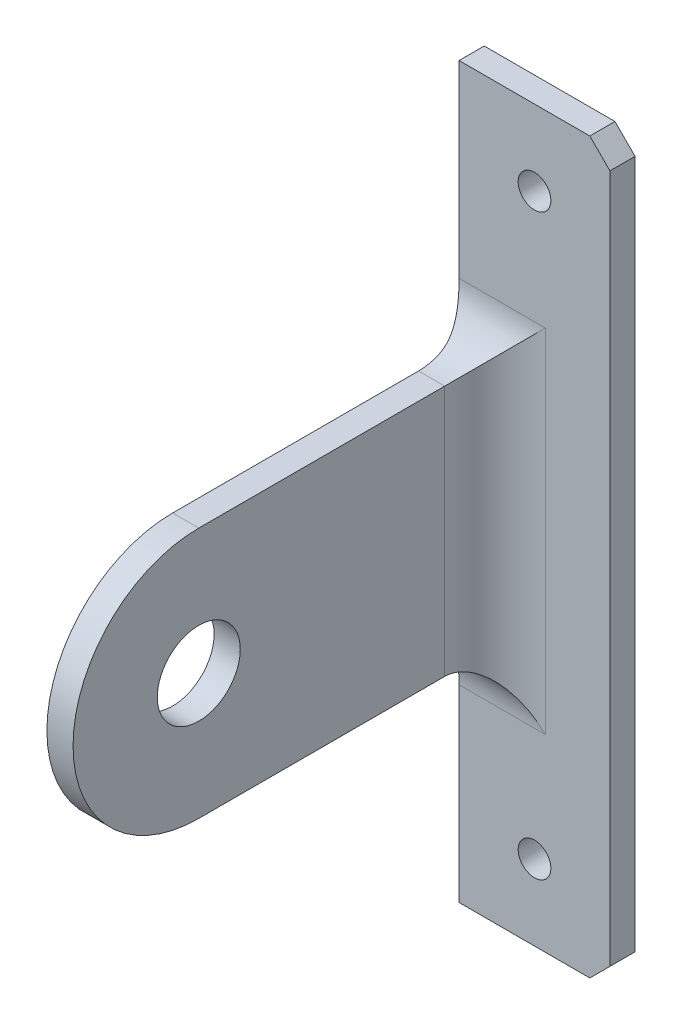
ISO-10303-21;
HEADER;
FILE_DESCRIPTION(('STEP AP214'),'2;1');
FILE_NAME('part.step','',(''),(''),'','','');
FILE_SCHEMA(('AUTOMOTIVE_DESIGN { 1 0 10303 214 1 1 1 1 }'));
ENDSEC;
DATA;
#1=APPLICATION_CONTEXT('core data for automotive mechanical design processes');
#2=APPLICATION_PROTOCOL_DEFINITION('international standard','automotive_design',2000,#1);
#3=PRODUCT_CONTEXT('',#1,'mechanical');
#4=PRODUCT('Part','Part','',(#3));
#5=PRODUCT_RELATED_PRODUCT_CATEGORY('part','',(#4));
#6=PRODUCT_DEFINITION_FORMATION('','',#4);
#7=PRODUCT_DEFINITION_CONTEXT('part definition',#1,'design');
#8=PRODUCT_DEFINITION('design','',#6,#7);
#9=PRODUCT_DEFINITION_SHAPE('','',#8);
#10=(LENGTH_UNIT() NAMED_UNIT(*) SI_UNIT(.MILLI.,.METRE.));
#11=(NAMED_UNIT(*) PLANE_ANGLE_UNIT() SI_UNIT($,.RADIAN.));
#12=(NAMED_UNIT(*) SI_UNIT($,.STERADIAN.) SOLID_ANGLE_UNIT());
#13=UNCERTAINTY_MEASURE_WITH_UNIT(LENGTH_MEASURE(1.E-05),#10,'distance_accuracy_value','');
#14=(GEOMETRIC_REPRESENTATION_CONTEXT(3) GLOBAL_UNCERTAINTY_ASSIGNED_CONTEXT((#13)) GLOBAL_UNIT_ASSIGNED_CONTEXT((#10,
#11,#12)) REPRESENTATION_CONTEXT('',''));
#15=CARTESIAN_POINT('',(0.,0.,0.));
#16=DIRECTION('',(0.,0.,1.));
#17=DIRECTION('',(1.,0.,0.));
#18=AXIS2_PLACEMENT_3D('',#15,#16,#17);
#19=CARTESIAN_POINT('',(2.6,12.5,-4.125));
#20=DIRECTION('',(-1.,0.,0.));
#21=DIRECTION('',(0.,0.,1.));
#22=AXIS2_PLACEMENT_3D('',#19,#20,#21);
#23=PLANE('',#22);
#24=CARTESIAN_POINT('',(2.6,0.,0.));
#25=DIRECTION('',(1.,0.,0.));
#26=DIRECTION('',(0.,0.,-1.));
#27=AXIS2_PLACEMENT_3D('',#24,#25,#26);
#28=CIRCLE('',#27,4.125);
#29=CARTESIAN_POINT('',(2.6,0.,-4.125));
#30=VERTEX_POINT('',#29);
#31=EDGE_CURVE('E188',#30,#30,#28,.T.);
#32=ORIENTED_EDGE('',*,*,#31,.F.);
#33=EDGE_LOOP('',(#32));
#34=FACE_BOUND('',#33,.T.);
#35=DIRECTION('',(0.,0.,-1.));
#36=VECTOR('',#35,1.);
#37=CARTESIAN_POINT('',(2.6,-12.5,-4.125));
#38=LINE('',#37,#36);
#39=CARTESIAN_POINT('',(2.6,-12.5,0.));
#40=VERTEX_POINT('',#39);
#41=CARTESIAN_POINT('',(2.6,-12.5,-24.45));
#42=VERTEX_POINT('',#41);
#43=EDGE_CURVE('E195',#40,#42,#38,.T.);
#44=ORIENTED_EDGE('',*,*,#43,.T.);
#45=DIRECTION('',(0.,-1.,0.));
#46=VECTOR('',#45,1.);
#47=CARTESIAN_POINT('',(2.6,12.5,-24.45));
#48=LINE('',#47,#46);
#49=CARTESIAN_POINT('',(2.6,12.5,-24.45));
#50=VERTEX_POINT('',#49);
#51=EDGE_CURVE('E224',#42,#50,#48,.F.);
#52=ORIENTED_EDGE('',*,*,#51,.T.);
#53=DIRECTION('',(0.,0.,-1.));
#54=VECTOR('',#53,1.);
#55=CARTESIAN_POINT('',(2.6,12.5,-4.125));
#56=LINE('',#55,#54);
#57=CARTESIAN_POINT('',(2.6,12.5,0.));
#58=VERTEX_POINT('',#57);
#59=EDGE_CURVE('E203',#58,#50,#56,.T.);
#60=ORIENTED_EDGE('',*,*,#59,.F.);
#61=CARTESIAN_POINT('',(2.6,0.,0.));
#62=DIRECTION('',(1.,0.,0.));
#63=DIRECTION('',(0.,0.,-1.));
#64=AXIS2_PLACEMENT_3D('',#61,#62,#63);
#65=CIRCLE('',#64,12.5);
#66=EDGE_CURVE('E196',#58,#40,#65,.T.);
#67=ORIENTED_EDGE('',*,*,#66,.T.);
#68=EDGE_LOOP('',(#44,#52,#60,#67));
#69=FACE_BOUND('',#68,.T.);
#70=ADVANCED_FACE('F41',(#34,#69),#23,.F.);
#71=CARTESIAN_POINT('',(0.,12.5,-4.125));
#72=DIRECTION('',(1.,0.,0.));
#73=DIRECTION('',(0.,0.,-1.));
#74=AXIS2_PLACEMENT_3D('',#71,#72,#73);
#75=PLANE('',#74);
#76=CARTESIAN_POINT('',(0.,0.,0.));
#77=DIRECTION('',(1.,0.,0.));
#78=DIRECTION('',(0.,0.,-1.));
#79=AXIS2_PLACEMENT_3D('',#76,#77,#78);
#80=CIRCLE('',#79,4.125);
#81=CARTESIAN_POINT('',(0.,0.,-4.125));
#82=VERTEX_POINT('',#81);
#83=EDGE_CURVE('E192',#82,#82,#80,.T.);
#84=ORIENTED_EDGE('',*,*,#83,.T.);
#85=EDGE_LOOP('',(#84));
#86=FACE_BOUND('',#85,.T.);
#87=DIRECTION('',(0.,0.,1.));
#88=VECTOR('',#87,1.);
#89=CARTESIAN_POINT('',(0.,12.5,-4.125));
#90=LINE('',#89,#88);
#91=CARTESIAN_POINT('',(0.,12.5,-24.45));
#92=VERTEX_POINT('',#91);
#93=CARTESIAN_POINT('',(0.,12.5,0.));
#94=VERTEX_POINT('',#93);
#95=EDGE_CURVE('E206',#92,#94,#90,.T.);
#96=ORIENTED_EDGE('',*,*,#95,.F.);
#97=CARTESIAN_POINT('',(0.,17.5,-24.45));
#98=DIRECTION('',(1.,0.,0.));
#99=DIRECTION('',(0.,0.,-1.));
#100=AXIS2_PLACEMENT_3D('',#97,#98,#99);
#101=CIRCLE('',#100,5.);
#102=CARTESIAN_POINT('',(0.,12.9352791185284,-26.4904223274257));
#103=VERTEX_POINT('',#102);
#104=EDGE_CURVE('E316',#92,#103,#101,.T.);
#105=ORIENTED_EDGE('',*,*,#104,.T.);
#106=CARTESIAN_POINT('',(0.,12.9352791185284,-26.4904223274257));
#107=CARTESIAN_POINT('',(0.,12.5,-26.4904223274257));
#108=B_SPLINE_CURVE_WITH_KNOTS('',1,(#106,#107),.UNSPECIFIED.,.F.,.F.,(2,2),(0.,1.),.UNSPECIFIED.);
#109=CARTESIAN_POINT('',(0.,12.5,-26.4904223274257));
#110=VERTEX_POINT('',#109);
#111=EDGE_CURVE('E228',#103,#110,#108,.T.);
#112=ORIENTED_EDGE('',*,*,#111,.T.);
#113=DIRECTION('',(0.,-1.,0.));
#114=VECTOR('',#113,1.);
#115=CARTESIAN_POINT('',(0.,12.5,-26.4904223274257));
#116=LINE('',#115,#114);
#117=CARTESIAN_POINT('',(0.,-12.5,-26.4904223274257));
#118=VERTEX_POINT('',#117);
#119=EDGE_CURVE('E220',#110,#118,#116,.T.);
#120=ORIENTED_EDGE('',*,*,#119,.T.);
#121=CARTESIAN_POINT('',(0.,-12.5,-26.4904223274257));
#122=CARTESIAN_POINT('',(0.,-12.9352791185284,-26.4904223274257));
#123=B_SPLINE_CURVE_WITH_KNOTS('',1,(#121,#122),.UNSPECIFIED.,.F.,.F.,(2,2),(0.,1.),.UNSPECIFIED.);
#124=CARTESIAN_POINT('',(0.,-12.9352791185284,-26.4904223274257));
#125=VERTEX_POINT('',#124);
#126=EDGE_CURVE('E232',#118,#125,#123,.T.);
#127=ORIENTED_EDGE('',*,*,#126,.T.);
#128=CARTESIAN_POINT('',(0.,-17.5,-24.45));
#129=DIRECTION('',(1.,0.,0.));
#130=DIRECTION('',(0.,0.,-1.));
#131=AXIS2_PLACEMENT_3D('',#128,#129,#130);
#132=CIRCLE('',#131,5.);
#133=CARTESIAN_POINT('',(0.,-12.5,-24.45));
#134=VERTEX_POINT('',#133);
#135=EDGE_CURVE('E226',#125,#134,#132,.T.);
#136=ORIENTED_EDGE('',*,*,#135,.T.);
#137=DIRECTION('',(0.,0.,1.));
#138=VECTOR('',#137,1.);
#139=CARTESIAN_POINT('',(0.,-12.5,-4.125));
#140=LINE('',#139,#138);
#141=CARTESIAN_POINT('',(0.,-12.5,0.));
#142=VERTEX_POINT('',#141);
#143=EDGE_CURVE('E207',#134,#142,#140,.T.);
#144=ORIENTED_EDGE('',*,*,#143,.T.);
#145=CARTESIAN_POINT('',(0.,0.,0.));
#146=DIRECTION('',(1.,0.,0.));
#147=DIRECTION('',(0.,0.,-1.));
#148=AXIS2_PLACEMENT_3D('',#145,#146,#147);
#149=CIRCLE('',#148,12.5);
#150=EDGE_CURVE('E184',#94,#142,#149,.T.);
#151=ORIENTED_EDGE('',*,*,#150,.F.);
#152=EDGE_LOOP('',(#96,#105,#112,#120,#127,#136,#144,#151));
#153=FACE_BOUND('',#152,.T.);
#154=ADVANCED_FACE('F235',(#86,#153),#75,.F.);
#155=CARTESIAN_POINT('',(2.6,12.5,-31.95));
#156=DIRECTION('',(0.,0.,1.));
#157=DIRECTION('',(1.,0.,0.));
#158=AXIS2_PLACEMENT_3D('',#155,#156,#157);
#159=PLANE('',#158);
#160=CARTESIAN_POINT('',(6.53,-28.75,-31.95));
#161=DIRECTION('',(0.,0.,1.));
#162=DIRECTION('',(-1.,0.,0.));
#163=AXIS2_PLACEMENT_3D('',#160,#161,#162);
#164=CIRCLE('',#163,1.625);
#165=CARTESIAN_POINT('',(4.905,-28.75,-31.95));
#166=VERTEX_POINT('',#165);
#167=EDGE_CURVE('E364',#166,#166,#164,.T.);
#168=ORIENTED_EDGE('',*,*,#167,.T.);
#169=EDGE_LOOP('',(#168));
#170=FACE_BOUND('',#169,.T.);
#171=CARTESIAN_POINT('',(6.53,28.75,-31.95));
#172=DIRECTION('',(0.,0.,-1.));
#173=DIRECTION('',(-1.,0.,0.));
#174=AXIS2_PLACEMENT_3D('',#171,#172,#173);
#175=CIRCLE('',#174,1.625);
#176=CARTESIAN_POINT('',(4.905,28.75,-31.95));
#177=VERTEX_POINT('',#176);
#178=EDGE_CURVE('E356',#177,#177,#175,.T.);
#179=ORIENTED_EDGE('',*,*,#178,.F.);
#180=EDGE_LOOP('',(#179));
#181=FACE_BOUND('',#180,.T.);
#182=DIRECTION('',(0.,-1.,0.));
#183=VECTOR('',#182,1.);
#184=CARTESIAN_POINT('',(14.03,12.5,-31.95));
#185=LINE('',#184,#183);
#186=CARTESIAN_POINT('',(14.03,34.25,-31.95));
#187=VERTEX_POINT('',#186);
#188=CARTESIAN_POINT('',(14.03,-34.25,-31.95));
#189=VERTEX_POINT('',#188);
#190=EDGE_CURVE('E181',#187,#189,#185,.T.);
#191=ORIENTED_EDGE('',*,*,#190,.T.);
#192=DIRECTION('',(0.70710678118655,0.707106781186545,0.));
#193=VECTOR('',#192,1.);
#194=CARTESIAN_POINT('',(14.03,-34.25,-31.95));
#195=LINE('',#194,#193);
#196=CARTESIAN_POINT('',(12.03,-36.25,-31.95));
#197=VERTEX_POINT('',#196);
#198=EDGE_CURVE('E311',#189,#197,#195,.F.);
#199=ORIENTED_EDGE('',*,*,#198,.T.);
#200=DIRECTION('',(1.,0.,0.));
#201=VECTOR('',#200,1.);
#202=CARTESIAN_POINT('',(-0.97,-36.25,-31.95));
#203=LINE('',#202,#201);
#204=CARTESIAN_POINT('',(-0.97,-36.25,-31.95));
#205=VERTEX_POINT('',#204);
#206=EDGE_CURVE('E162',#205,#197,#203,.T.);
#207=ORIENTED_EDGE('',*,*,#206,.F.);
#208=DIRECTION('',(0.,-1.,0.));
#209=VECTOR('',#208,1.);
#210=CARTESIAN_POINT('',(-0.97,12.5,-31.95));
#211=LINE('',#210,#209);
#212=CARTESIAN_POINT('',(-0.97,36.25,-31.95));
#213=VERTEX_POINT('',#212);
#214=EDGE_CURVE('E166',#213,#205,#211,.T.);
#215=ORIENTED_EDGE('',*,*,#214,.F.);
#216=DIRECTION('',(1.,0.,0.));
#217=VECTOR('',#216,1.);
#218=CARTESIAN_POINT('',(14.03,36.25,-31.95));
#219=LINE('',#218,#217);
#220=CARTESIAN_POINT('',(12.03,36.25,-31.95));
#221=VERTEX_POINT('',#220);
#222=EDGE_CURVE('E167',#213,#221,#219,.T.);
#223=ORIENTED_EDGE('',*,*,#222,.T.);
#224=DIRECTION('',(0.707106781186545,-0.70710678118655,0.));
#225=VECTOR('',#224,1.);
#226=CARTESIAN_POINT('',(12.03,36.25,-31.95));
#227=LINE('',#226,#225);
#228=EDGE_CURVE('E313',#221,#187,#227,.T.);
#229=ORIENTED_EDGE('',*,*,#228,.T.);
#230=EDGE_LOOP('',(#191,#199,#207,#215,#223,#229));
#231=FACE_BOUND('',#230,.T.);
#232=ADVANCED_FACE('F245',(#170,#181,#231),#159,.F.);
#233=CARTESIAN_POINT('',(0.,12.5,0.));
#234=DIRECTION('',(0.,1.,0.));
#235=DIRECTION('',(0.,0.,1.));
#236=AXIS2_PLACEMENT_3D('',#233,#234,#235);
#237=PLANE('',#236);
#238=ORIENTED_EDGE('',*,*,#59,.T.);
#239=DIRECTION('',(-1.,0.,0.));
#240=VECTOR('',#239,1.);
#241=CARTESIAN_POINT('',(0.,12.5,-24.45));
#242=LINE('',#241,#240);
#243=EDGE_CURVE('E222',#50,#92,#242,.T.);
#244=ORIENTED_EDGE('',*,*,#243,.T.);
#245=ORIENTED_EDGE('',*,*,#95,.T.);
#246=DIRECTION('',(-1.,0.,0.));
#247=VECTOR('',#246,1.);
#248=CARTESIAN_POINT('',(2.6,12.5,0.));
#249=LINE('',#248,#247);
#250=EDGE_CURVE('E189',#58,#94,#249,.T.);
#251=ORIENTED_EDGE('',*,*,#250,.F.);
#252=EDGE_LOOP('',(#238,#244,#245,#251));
#253=FACE_BOUND('',#252,.T.);
#254=ADVANCED_FACE('F252',(#253),#237,.T.);
#255=CARTESIAN_POINT('',(0.,-12.5,0.));
#256=DIRECTION('',(0.,1.,0.));
#257=DIRECTION('',(0.,0.,1.));
#258=AXIS2_PLACEMENT_3D('',#255,#256,#257);
#259=PLANE('',#258);
#260=ORIENTED_EDGE('',*,*,#143,.F.);
#261=DIRECTION('',(-1.,0.,0.));
#262=VECTOR('',#261,1.);
#263=CARTESIAN_POINT('',(2.6,-12.5,-24.45));
#264=LINE('',#263,#262);
#265=EDGE_CURVE('E217',#134,#42,#264,.F.);
#266=ORIENTED_EDGE('',*,*,#265,.T.);
#267=ORIENTED_EDGE('',*,*,#43,.F.);
#268=DIRECTION('',(-1.,0.,0.));
#269=VECTOR('',#268,1.);
#270=CARTESIAN_POINT('',(2.6,-12.5,0.));
#271=LINE('',#270,#269);
#272=EDGE_CURVE('E185',#40,#142,#271,.T.);
#273=ORIENTED_EDGE('',*,*,#272,.T.);
#274=EDGE_LOOP('',(#260,#266,#267,#273));
#275=FACE_BOUND('',#274,.T.);
#276=ADVANCED_FACE('F247',(#275),#259,.F.);
#277=CARTESIAN_POINT('',(2.6,0.,0.));
#278=DIRECTION('',(-1.,0.,0.));
#279=DIRECTION('',(0.,0.,1.));
#280=AXIS2_PLACEMENT_3D('',#277,#278,#279);
#281=CYLINDRICAL_SURFACE('',#280,12.5);
#282=ORIENTED_EDGE('',*,*,#150,.T.);
#283=ORIENTED_EDGE('',*,*,#272,.F.);
#284=ORIENTED_EDGE('',*,*,#66,.F.);
#285=ORIENTED_EDGE('',*,*,#250,.T.);
#286=EDGE_LOOP('',(#282,#283,#284,#285));
#287=FACE_BOUND('',#286,.T.);
#288=ADVANCED_FACE('F339',(#287),#281,.T.);
#289=CARTESIAN_POINT('',(2.6,0.,0.));
#290=DIRECTION('',(-1.,0.,0.));
#291=DIRECTION('',(0.,0.,1.));
#292=AXIS2_PLACEMENT_3D('',#289,#290,#291);
#293=CYLINDRICAL_SURFACE('',#292,4.125);
#294=ORIENTED_EDGE('',*,*,#31,.T.);
#295=EDGE_LOOP('',(#294));
#296=FACE_BOUND('',#295,.T.);
#297=ORIENTED_EDGE('',*,*,#83,.F.);
#298=EDGE_LOOP('',(#297));
#299=FACE_BOUND('',#298,.T.);
#300=ADVANCED_FACE('F380',(#296,#299),#293,.F.);
#301=CARTESIAN_POINT('',(-0.97,12.5,-31.95));
#302=DIRECTION('',(1.,0.,0.));
#303=DIRECTION('',(0.,0.,-1.));
#304=AXIS2_PLACEMENT_3D('',#301,#302,#303);
#305=PLANE('',#304);
#306=ORIENTED_EDGE('',*,*,#214,.T.);
#307=DIRECTION('',(0.,0.,-1.));
#308=VECTOR('',#307,1.);
#309=CARTESIAN_POINT('',(-0.97,-36.25,-29.45));
#310=LINE('',#309,#308);
#311=CARTESIAN_POINT('',(-0.97,-36.25,-29.45));
#312=VERTEX_POINT('',#311);
#313=EDGE_CURVE('E160',#312,#205,#310,.T.);
#314=ORIENTED_EDGE('',*,*,#313,.F.);
#315=DIRECTION('',(0.,-1.,0.));
#316=VECTOR('',#315,1.);
#317=CARTESIAN_POINT('',(-0.97,12.5,-29.45));
#318=LINE('',#317,#316);
#319=CARTESIAN_POINT('',(-0.97,-17.5,-29.45));
#320=VERTEX_POINT('',#319);
#321=EDGE_CURVE('E146',#320,#312,#318,.T.);
#322=ORIENTED_EDGE('',*,*,#321,.F.);
#323=CARTESIAN_POINT('',(-0.97,17.5,-29.45));
#324=VERTEX_POINT('',#323);
#325=EDGE_CURVE('E154',#324,#320,#318,.T.);
#326=ORIENTED_EDGE('',*,*,#325,.F.);
#327=CARTESIAN_POINT('',(-0.97,36.25,-29.45));
#328=VERTEX_POINT('',#327);
#329=EDGE_CURVE('E157',#328,#324,#318,.T.);
#330=ORIENTED_EDGE('',*,*,#329,.F.);
#331=DIRECTION('',(0.,0.,-1.));
#332=VECTOR('',#331,1.);
#333=CARTESIAN_POINT('',(-0.97,36.25,-29.45));
#334=LINE('',#333,#332);
#335=EDGE_CURVE('E174',#328,#213,#334,.T.);
#336=ORIENTED_EDGE('',*,*,#335,.T.);
#337=EDGE_LOOP('',(#306,#314,#322,#326,#330,#336));
#338=FACE_BOUND('',#337,.T.);
#339=ADVANCED_FACE('F164',(#338),#305,.F.);
#340=CARTESIAN_POINT('',(14.03,12.5,-29.45));
#341=DIRECTION('',(0.,0.,-1.));
#342=DIRECTION('',(-1.,0.,0.));
#343=AXIS2_PLACEMENT_3D('',#340,#341,#342);
#344=PLANE('',#343);
#345=CARTESIAN_POINT('',(6.53,-28.75,-29.45));
#346=DIRECTION('',(0.,0.,1.));
#347=DIRECTION('',(-1.,0.,0.));
#348=AXIS2_PLACEMENT_3D('',#345,#346,#347);
#349=CIRCLE('',#348,1.625);
#350=CARTESIAN_POINT('',(4.905,-28.75,-29.45));
#351=VERTEX_POINT('',#350);
#352=EDGE_CURVE('E361',#351,#351,#349,.T.);
#353=ORIENTED_EDGE('',*,*,#352,.F.);
#354=EDGE_LOOP('',(#353));
#355=FACE_BOUND('',#354,.T.);
#356=CARTESIAN_POINT('',(6.53,28.75,-29.45));
#357=DIRECTION('',(0.,0.,-1.));
#358=DIRECTION('',(-1.,0.,0.));
#359=AXIS2_PLACEMENT_3D('',#356,#357,#358);
#360=CIRCLE('',#359,1.625);
#361=CARTESIAN_POINT('',(4.905,28.75,-29.45));
#362=VERTEX_POINT('',#361);
#363=EDGE_CURVE('E354',#362,#362,#360,.T.);
#364=ORIENTED_EDGE('',*,*,#363,.T.);
#365=EDGE_LOOP('',(#364));
#366=FACE_BOUND('',#365,.T.);
#367=DIRECTION('',(1.,0.,0.));
#368=VECTOR('',#367,1.);
#369=CARTESIAN_POINT('',(14.03,-36.25,-29.45));
#370=LINE('',#369,#368);
#371=CARTESIAN_POINT('',(12.03,-36.25,-29.45));
#372=VERTEX_POINT('',#371);
#373=EDGE_CURVE('E148',#312,#372,#370,.T.);
#374=ORIENTED_EDGE('',*,*,#373,.T.);
#375=DIRECTION('',(-0.70710678118655,-0.707106781186545,0.));
#376=VECTOR('',#375,1.);
#377=CARTESIAN_POINT('',(14.03,-34.25,-29.45));
#378=LINE('',#377,#376);
#379=CARTESIAN_POINT('',(14.03,-34.25,-29.45));
#380=VERTEX_POINT('',#379);
#381=EDGE_CURVE('E50',#372,#380,#378,.F.);
#382=ORIENTED_EDGE('',*,*,#381,.T.);
#383=DIRECTION('',(0.,-1.,0.));
#384=VECTOR('',#383,1.);
#385=CARTESIAN_POINT('',(14.03,12.5,-29.45));
#386=LINE('',#385,#384);
#387=CARTESIAN_POINT('',(14.03,34.25,-29.45));
#388=VERTEX_POINT('',#387);
#389=EDGE_CURVE('E155',#388,#380,#386,.T.);
#390=ORIENTED_EDGE('',*,*,#389,.F.);
#391=DIRECTION('',(-0.707106781186545,0.70710678118655,0.));
#392=VECTOR('',#391,1.);
#393=CARTESIAN_POINT('',(12.03,36.25,-29.45));
#394=LINE('',#393,#392);
#395=CARTESIAN_POINT('',(12.03,36.25,-29.45));
#396=VERTEX_POINT('',#395);
#397=EDGE_CURVE('E57',#388,#396,#394,.T.);
#398=ORIENTED_EDGE('',*,*,#397,.T.);
#399=DIRECTION('',(1.,0.,0.));
#400=VECTOR('',#399,1.);
#401=CARTESIAN_POINT('',(-0.97,36.25,-29.45));
#402=LINE('',#401,#400);
#403=EDGE_CURVE('E170',#328,#396,#402,.T.);
#404=ORIENTED_EDGE('',*,*,#403,.F.);
#405=ORIENTED_EDGE('',*,*,#329,.T.);
#406=DIRECTION('',(-1.,0.,0.));
#407=VECTOR('',#406,1.);
#408=CARTESIAN_POINT('',(14.03,17.5,-29.45));
#409=LINE('',#408,#407);
#410=CARTESIAN_POINT('',(7.6,17.5,-29.45));
#411=VERTEX_POINT('',#410);
#412=EDGE_CURVE('E214',#324,#411,#409,.F.);
#413=ORIENTED_EDGE('',*,*,#412,.T.);
#414=DIRECTION('',(0.,-1.,0.));
#415=VECTOR('',#414,1.);
#416=CARTESIAN_POINT('',(7.6,-12.5,-29.45));
#417=LINE('',#416,#415);
#418=CARTESIAN_POINT('',(7.6,-17.5,-29.45));
#419=VERTEX_POINT('',#418);
#420=EDGE_CURVE('E209',#411,#419,#417,.T.);
#421=ORIENTED_EDGE('',*,*,#420,.T.);
#422=DIRECTION('',(-1.,0.,0.));
#423=VECTOR('',#422,1.);
#424=CARTESIAN_POINT('',(0.,-17.5,-29.45));
#425=LINE('',#424,#423);
#426=EDGE_CURVE('E151',#419,#320,#425,.T.);
#427=ORIENTED_EDGE('',*,*,#426,.T.);
#428=ORIENTED_EDGE('',*,*,#321,.T.);
#429=EDGE_LOOP('',(#374,#382,#390,#398,#404,#405,#413,#421,#427,#428));
#430=FACE_BOUND('',#429,.T.);
#431=ADVANCED_FACE('F147',(#355,#366,#430),#344,.F.);
#432=CARTESIAN_POINT('',(14.03,12.5,-31.95));
#433=DIRECTION('',(-1.,0.,0.));
#434=DIRECTION('',(0.,0.,1.));
#435=AXIS2_PLACEMENT_3D('',#432,#433,#434);
#436=PLANE('',#435);
#437=ORIENTED_EDGE('',*,*,#389,.T.);
#438=DIRECTION('',(0.,0.,-1.));
#439=VECTOR('',#438,1.);
#440=CARTESIAN_POINT('',(14.03,-34.25,-31.95));
#441=LINE('',#440,#439);
#442=EDGE_CURVE('E307',#380,#189,#441,.T.);
#443=ORIENTED_EDGE('',*,*,#442,.T.);
#444=ORIENTED_EDGE('',*,*,#190,.F.);
#445=DIRECTION('',(0.,0.,1.));
#446=VECTOR('',#445,1.);
#447=CARTESIAN_POINT('',(14.03,34.25,-29.45));
#448=LINE('',#447,#446);
#449=EDGE_CURVE('E315',#187,#388,#448,.T.);
#450=ORIENTED_EDGE('',*,*,#449,.T.);
#451=EDGE_LOOP('',(#437,#443,#444,#450));
#452=FACE_BOUND('',#451,.T.);
#453=ADVANCED_FACE('F373',(#452),#436,.F.);
#454=CARTESIAN_POINT('',(14.03,36.25,-29.45));
#455=DIRECTION('',(0.,1.,0.));
#456=DIRECTION('',(0.,0.,1.));
#457=AXIS2_PLACEMENT_3D('',#454,#455,#456);
#458=PLANE('',#457);
#459=ORIENTED_EDGE('',*,*,#403,.T.);
#460=DIRECTION('',(0.,0.,-1.));
#461=VECTOR('',#460,1.);
#462=CARTESIAN_POINT('',(12.03,36.25,-31.95));
#463=LINE('',#462,#461);
#464=EDGE_CURVE('E11',#396,#221,#463,.T.);
#465=ORIENTED_EDGE('',*,*,#464,.T.);
#466=ORIENTED_EDGE('',*,*,#222,.F.);
#467=ORIENTED_EDGE('',*,*,#335,.F.);
#468=EDGE_LOOP('',(#459,#465,#466,#467));
#469=FACE_BOUND('',#468,.T.);
#470=ADVANCED_FACE('F351',(#469),#458,.T.);
#471=CARTESIAN_POINT('',(-0.97,-36.25,-29.45));
#472=DIRECTION('',(0.,1.,0.));
#473=DIRECTION('',(0.,0.,1.));
#474=AXIS2_PLACEMENT_3D('',#471,#472,#473);
#475=PLANE('',#474);
#476=ORIENTED_EDGE('',*,*,#206,.T.);
#477=DIRECTION('',(0.,0.,1.));
#478=VECTOR('',#477,1.);
#479=CARTESIAN_POINT('',(12.03,-36.25,-29.45));
#480=LINE('',#479,#478);
#481=EDGE_CURVE('E65',#197,#372,#480,.T.);
#482=ORIENTED_EDGE('',*,*,#481,.T.);
#483=ORIENTED_EDGE('',*,*,#373,.F.);
#484=ORIENTED_EDGE('',*,*,#313,.T.);
#485=EDGE_LOOP('',(#476,#482,#483,#484));
#486=FACE_BOUND('',#485,.T.);
#487=ADVANCED_FACE('F159',(#486),#475,.F.);
#488=CARTESIAN_POINT('',(6.53,28.75,-29.45));
#489=DIRECTION('',(0.,0.,-1.));
#490=DIRECTION('',(-1.,0.,0.));
#491=AXIS2_PLACEMENT_3D('',#488,#489,#490);
#492=CYLINDRICAL_SURFACE('',#491,1.625);
#493=ORIENTED_EDGE('',*,*,#363,.F.);
#494=EDGE_LOOP('',(#493));
#495=FACE_BOUND('',#494,.T.);
#496=ORIENTED_EDGE('',*,*,#178,.T.);
#497=EDGE_LOOP('',(#496));
#498=FACE_BOUND('',#497,.T.);
#499=ADVANCED_FACE('F472',(#495,#498),#492,.F.);
#500=CARTESIAN_POINT('',(6.53,-28.75,-29.45));
#501=DIRECTION('',(0.,0.,-1.));
#502=DIRECTION('',(-1.,0.,0.));
#503=AXIS2_PLACEMENT_3D('',#500,#501,#502);
#504=CYLINDRICAL_SURFACE('',#503,1.625);
#505=ORIENTED_EDGE('',*,*,#352,.T.);
#506=EDGE_LOOP('',(#505));
#507=FACE_BOUND('',#506,.T.);
#508=ORIENTED_EDGE('',*,*,#167,.F.);
#509=EDGE_LOOP('',(#508));
#510=FACE_BOUND('',#509,.T.);
#511=ADVANCED_FACE('F289',(#507,#510),#504,.F.);
#512=CARTESIAN_POINT('',(0.,17.5,-24.45));
#513=DIRECTION('',(-1.,0.,0.));
#514=DIRECTION('',(0.,0.,1.));
#515=AXIS2_PLACEMENT_3D('',#512,#513,#514);
#516=CYLINDRICAL_SURFACE('',#515,5.);
#517=ORIENTED_EDGE('',*,*,#104,.F.);
#518=ORIENTED_EDGE('',*,*,#243,.F.);
#519=CARTESIAN_POINT('',(7.6,17.5,-24.45));
#520=DIRECTION('',(-0.707106781186547,0.707106781186547,0.));
#521=DIRECTION('',(0.707106781186547,0.707106781186547,0.));
#522=AXIS2_PLACEMENT_3D('',#519,#520,#521);
#523=ELLIPSE('',#522,7.07106781186547,5.);
#524=EDGE_CURVE('E282',#411,#50,#523,.T.);
#525=ORIENTED_EDGE('',*,*,#524,.F.);
#526=ORIENTED_EDGE('',*,*,#412,.F.);
#527=CARTESIAN_POINT('',(-0.97,17.5,-29.45));
#528=CARTESIAN_POINT('',(-0.970079899164056,17.3701049038207,-29.4500301365659));
#529=CARTESIAN_POINT('',(-0.966284576796977,17.2402500129345,-29.444939803141));
#530=CARTESIAN_POINT('',(-0.951551204793543,16.9818840424503,-29.4247605335802));
#531=CARTESIAN_POINT('',(-0.940622043722495,16.8533714925146,-29.409684039579));
#532=CARTESIAN_POINT('',(-0.912352046299374,16.5997565240031,-29.3699509679432));
#533=CARTESIAN_POINT('',(-0.895069028094303,16.4746339537154,-29.3453806810961));
#534=CARTESIAN_POINT('',(-0.855082497576353,16.2274269727635,-29.2870124477417));
#535=CARTESIAN_POINT('',(-0.832377482086573,16.105343415008,-29.2532119419049));
#536=CARTESIAN_POINT('',(-0.782816880609937,15.8654559815642,-29.1769477642139));
#537=CARTESIAN_POINT('',(-0.755981566245618,15.747634500377,-29.1345260958268));
#538=CARTESIAN_POINT('',(-0.699294757293463,15.516152033476,-29.0412870186986));
#539=CARTESIAN_POINT('',(-0.66944340943242,15.4024908457345,-28.9904700183051));
#540=CARTESIAN_POINT('',(-0.57696028922591,15.0675079823907,-28.8255122349336));
#541=CARTESIAN_POINT('',(-0.511559151953342,14.8528962193414,-28.6990922281402));
#542=CARTESIAN_POINT('',(-0.374301258983328,14.4173656935916,-28.3967087622663));
#543=CARTESIAN_POINT('',(-0.302726350453535,14.1993278789313,-28.2164166862097));
#544=CARTESIAN_POINT('',(-0.207238058290553,13.8961997256557,-27.9188054355513));
#545=CARTESIAN_POINT('',(-0.177418352421783,13.7992543282084,-27.8152232280683));
#546=CARTESIAN_POINT('',(-0.123261300433566,13.6139193241557,-27.5993808257014));
#547=CARTESIAN_POINT('',(-0.0989212666786567,13.5255255353961,-27.4871249214883));
#548=CARTESIAN_POINT('',(-0.0537066998880335,13.3435807966599,-27.234315876693));
#549=CARTESIAN_POINT('',(-0.0341646858240219,13.2517928573734,-27.092231038347));
#550=CARTESIAN_POINT('',(-0.0140201579687512,13.1248539090104,-26.8718450740968));
#551=CARTESIAN_POINT('',(-0.00883237271217802,13.0842682072443,-26.7970322882268));
#552=CARTESIAN_POINT('',(-0.00182011807073649,13.0068846804583,-26.6452626313622));
#553=CARTESIAN_POINT('',(2.25806700241875E-06,12.970089226354,-26.5683044561425));
#554=CARTESIAN_POINT('',(0.,12.9352791185284,-26.4904223274257));
#555=B_SPLINE_CURVE_WITH_KNOTS('',3,(#527,#528,#529,#530,#531,#532,#533,#534,#535,#536,#537,
#538,#539,#540,#541,#542,#543,#544,#545,#546,#547,#548,#549,#550,#551,#552,#553,#554),
.UNSPECIFIED.,.F.,.F.,(4,2,2,2,2,2,2,2,2,2,2,2,2,4),(0.,0.389466311164096,0.77844828202075,
1.16397487652975,1.54960847751762,1.93340642142806,2.31718570296248,3.08700618817996,
3.95804575551257,4.39245108998988,4.82664289359202,5.33611464761218,5.59177105585042,
5.84758642604938),.UNSPECIFIED.);
#556=EDGE_CURVE('E275',#103,#324,#555,.F.);
#557=ORIENTED_EDGE('',*,*,#556,.F.);
#558=EDGE_LOOP('',(#517,#518,#525,#526,#557));
#559=FACE_BOUND('',#558,.T.);
#560=ADVANCED_FACE('F285',(#559),#516,.F.);
#561=CARTESIAN_POINT('',(7.6,12.5,-24.45));
#562=DIRECTION('',(0.,1.,0.));
#563=DIRECTION('',(0.,0.,1.));
#564=AXIS2_PLACEMENT_3D('',#561,#562,#563);
#565=CYLINDRICAL_SURFACE('',#564,5.);
#566=ORIENTED_EDGE('',*,*,#524,.T.);
#567=ORIENTED_EDGE('',*,*,#51,.F.);
#568=CARTESIAN_POINT('',(7.6,-17.5,-24.45));
#569=DIRECTION('',(0.707106781186547,0.707106781186547,0.));
#570=DIRECTION('',(-0.707106781186547,0.707106781186547,0.));
#571=AXIS2_PLACEMENT_3D('',#568,#569,#570);
#572=ELLIPSE('',#571,7.07106781186547,5.);
#573=EDGE_CURVE('E283',#419,#42,#572,.T.);
#574=ORIENTED_EDGE('',*,*,#573,.F.);
#575=ORIENTED_EDGE('',*,*,#420,.F.);
#576=EDGE_LOOP('',(#566,#567,#574,#575));
#577=FACE_BOUND('',#576,.T.);
#578=ADVANCED_FACE('F262',(#577),#565,.F.);
#579=CARTESIAN_POINT('',(-5.,12.5,-26.4904223274257));
#580=DIRECTION('',(0.,-1.,0.));
#581=DIRECTION('',(0.,0.,-1.));
#582=AXIS2_PLACEMENT_3D('',#579,#580,#581);
#583=CYLINDRICAL_SURFACE('',#582,5.);
#584=ORIENTED_EDGE('',*,*,#556,.T.);
#585=ORIENTED_EDGE('',*,*,#325,.T.);
#586=CARTESIAN_POINT('',(-0.97,-17.5,-29.45));
#587=CARTESIAN_POINT('',(-0.970079899164056,-17.3701049038207,-29.4500301365659));
#588=CARTESIAN_POINT('',(-0.966284576796977,-17.2402500129345,-29.444939803141));
#589=CARTESIAN_POINT('',(-0.951551204793543,-16.9818840424503,-29.4247605335802));
#590=CARTESIAN_POINT('',(-0.940622043722495,-16.8533714925146,-29.409684039579));
#591=CARTESIAN_POINT('',(-0.912352046299374,-16.5997565240031,-29.3699509679432));
#592=CARTESIAN_POINT('',(-0.895069028094303,-16.4746339537154,-29.3453806810961));
#593=CARTESIAN_POINT('',(-0.855082497576353,-16.2274269727635,-29.2870124477417));
#594=CARTESIAN_POINT('',(-0.832377482086573,-16.105343415008,-29.2532119419049));
#595=CARTESIAN_POINT('',(-0.782816880609937,-15.8654559815642,-29.1769477642139));
#596=CARTESIAN_POINT('',(-0.755981566245618,-15.747634500377,-29.1345260958268));
#597=CARTESIAN_POINT('',(-0.699294757293463,-15.516152033476,-29.0412870186986));
#598=CARTESIAN_POINT('',(-0.66944340943242,-15.4024908457345,-28.9904700183051));
#599=CARTESIAN_POINT('',(-0.57696028922591,-15.0675079823907,-28.8255122349336));
#600=CARTESIAN_POINT('',(-0.511559151953341,-14.8528962193414,-28.6990922281402));
#601=CARTESIAN_POINT('',(-0.374301258983328,-14.4173656935916,-28.3967087622663));
#602=CARTESIAN_POINT('',(-0.302726350453535,-14.1993278789313,-28.2164166862097));
#603=CARTESIAN_POINT('',(-0.207238058290553,-13.8961997256557,-27.9188054355513));
#604=CARTESIAN_POINT('',(-0.177418352421783,-13.7992543282084,-27.8152232280683));
#605=CARTESIAN_POINT('',(-0.123261300433566,-13.6139193241557,-27.5993808257014));
#606=CARTESIAN_POINT('',(-0.0989212666786568,-13.5255255353961,-27.4871249214883));
#607=CARTESIAN_POINT('',(-0.0537066998880336,-13.3435807966599,-27.234315876693));
#608=CARTESIAN_POINT('',(-0.034164685824022,-13.2517928573734,-27.092231038347));
#609=CARTESIAN_POINT('',(-0.0140201579687513,-13.1248539090104,-26.8718450740968));
#610=CARTESIAN_POINT('',(-0.00883237271217809,-13.0842682072443,-26.7970322882268));
#611=CARTESIAN_POINT('',(-0.00182011807073658,-13.0068846804583,-26.6452626313622));
#612=CARTESIAN_POINT('',(2.25806700232282E-06,-12.970089226354,-26.5683044561425));
#613=CARTESIAN_POINT('',(0.,-12.9352791185284,-26.4904223274257));
#614=B_SPLINE_CURVE_WITH_KNOTS('',3,(#586,#587,#588,#589,#590,#591,#592,#593,#594,#595,#596,
#597,#598,#599,#600,#601,#602,#603,#604,#605,#606,#607,#608,#609,#610,#611,#612,#613),
.UNSPECIFIED.,.F.,.F.,(4,2,2,2,2,2,2,2,2,2,2,2,2,4),(0.,0.389466311164096,0.77844828202075,
1.16397487652975,1.54960847751762,1.93340642142806,2.31718570296248,3.08700618817996,
3.95804575551257,4.39245108998988,4.82664289359202,5.33611464761218,5.59177105585042,
5.84758642604938),.UNSPECIFIED.);
#615=EDGE_CURVE('E268',#125,#320,#614,.F.);
#616=ORIENTED_EDGE('',*,*,#615,.F.);
#617=ORIENTED_EDGE('',*,*,#126,.F.);
#618=ORIENTED_EDGE('',*,*,#119,.F.);
#619=ORIENTED_EDGE('',*,*,#111,.F.);
#620=EDGE_LOOP('',(#584,#585,#616,#617,#618,#619));
#621=FACE_BOUND('',#620,.T.);
#622=ADVANCED_FACE('F257',(#621),#583,.F.);
#623=CARTESIAN_POINT('',(14.03,-17.5,-24.45));
#624=DIRECTION('',(1.,0.,0.));
#625=DIRECTION('',(0.,0.,-1.));
#626=AXIS2_PLACEMENT_3D('',#623,#624,#625);
#627=CYLINDRICAL_SURFACE('',#626,5.);
#628=ORIENTED_EDGE('',*,*,#573,.T.);
#629=ORIENTED_EDGE('',*,*,#265,.F.);
#630=ORIENTED_EDGE('',*,*,#135,.F.);
#631=ORIENTED_EDGE('',*,*,#615,.T.);
#632=ORIENTED_EDGE('',*,*,#426,.F.);
#633=EDGE_LOOP('',(#628,#629,#630,#631,#632));
#634=FACE_BOUND('',#633,.T.);
#635=ADVANCED_FACE('F261',(#634),#627,.F.);
#636=CARTESIAN_POINT('',(14.03,-34.25,-31.95));
#637=DIRECTION('',(-0.707106781186545,0.70710678118655,0.));
#638=DIRECTION('',(0.,0.,-1.));
#639=AXIS2_PLACEMENT_3D('',#636,#637,#638);
#640=PLANE('',#639);
#641=ORIENTED_EDGE('',*,*,#381,.F.);
#642=ORIENTED_EDGE('',*,*,#481,.F.);
#643=ORIENTED_EDGE('',*,*,#198,.F.);
#644=ORIENTED_EDGE('',*,*,#442,.F.);
#645=EDGE_LOOP('',(#641,#642,#643,#644));
#646=FACE_BOUND('',#645,.T.);
#647=ADVANCED_FACE('F294',(#646),#640,.F.);
#648=CARTESIAN_POINT('',(12.03,36.25,-29.45));
#649=DIRECTION('',(0.70710678118655,0.707106781186545,0.));
#650=DIRECTION('',(0.,0.,1.));
#651=AXIS2_PLACEMENT_3D('',#648,#649,#650);
#652=PLANE('',#651);
#653=ORIENTED_EDGE('',*,*,#397,.F.);
#654=ORIENTED_EDGE('',*,*,#449,.F.);
#655=ORIENTED_EDGE('',*,*,#228,.F.);
#656=ORIENTED_EDGE('',*,*,#464,.F.);
#657=EDGE_LOOP('',(#653,#654,#655,#656));
#658=FACE_BOUND('',#657,.T.);
#659=ADVANCED_FACE('F44',(#658),#652,.T.);
#660=CLOSED_SHELL('',(#70,#154,#232,#254,#276,#288,#300,#339,#431,#453,#470,#487,#499,#511,#560,
#578,#622,#635,#647,#659));
#661=MANIFOLD_SOLID_BREP('B2',#660);
#662=ADVANCED_BREP_SHAPE_REPRESENTATION('',(#18,#661),#14);
#663=SHAPE_DEFINITION_REPRESENTATION(#9,#662);
ENDSEC;
END-ISO-10303-21;
